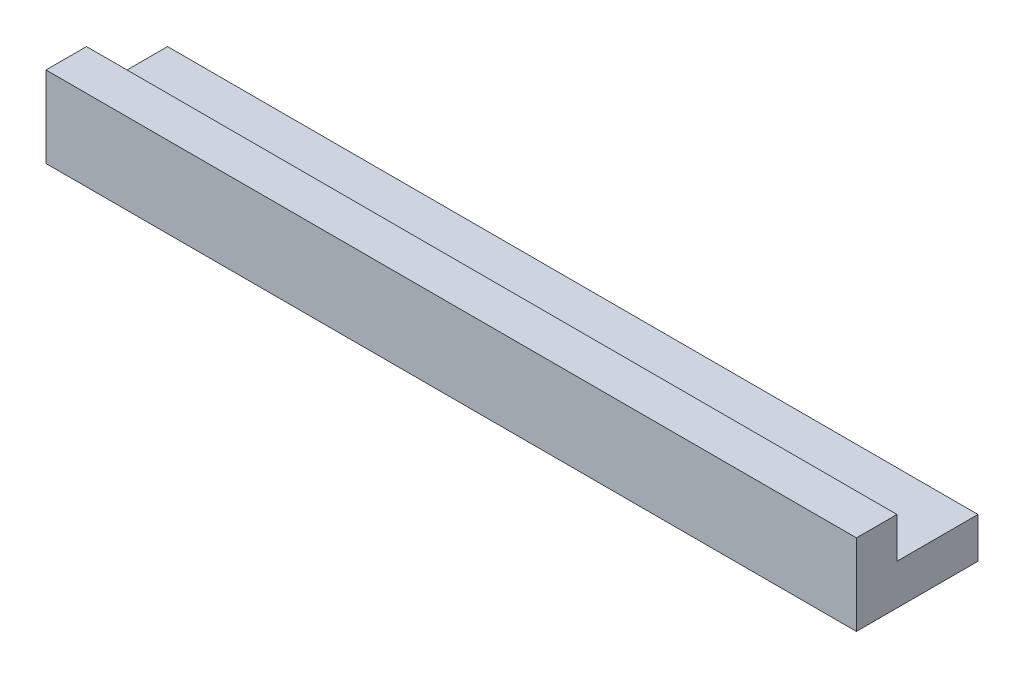
ISO-10303-21;
HEADER;
FILE_DESCRIPTION(('STEP AP214'),'2;1');
FILE_NAME('part.step','',(''),(''),'','','');
FILE_SCHEMA(('AUTOMOTIVE_DESIGN { 1 0 10303 214 1 1 1 1 }'));
ENDSEC;
DATA;
#1=APPLICATION_CONTEXT('core data for automotive mechanical design processes');
#2=APPLICATION_PROTOCOL_DEFINITION('international standard','automotive_design',2000,#1);
#3=PRODUCT_CONTEXT('',#1,'mechanical');
#4=PRODUCT('Part','Part','',(#3));
#5=PRODUCT_RELATED_PRODUCT_CATEGORY('part','',(#4));
#6=PRODUCT_DEFINITION_FORMATION('','',#4);
#7=PRODUCT_DEFINITION_CONTEXT('part definition',#1,'design');
#8=PRODUCT_DEFINITION('design','',#6,#7);
#9=PRODUCT_DEFINITION_SHAPE('','',#8);
#10=(LENGTH_UNIT() NAMED_UNIT(*) SI_UNIT(.MILLI.,.METRE.));
#11=(NAMED_UNIT(*) PLANE_ANGLE_UNIT() SI_UNIT($,.RADIAN.));
#12=(NAMED_UNIT(*) SI_UNIT($,.STERADIAN.) SOLID_ANGLE_UNIT());
#13=UNCERTAINTY_MEASURE_WITH_UNIT(LENGTH_MEASURE(1.E-05),#10,'distance_accuracy_value','');
#14=(GEOMETRIC_REPRESENTATION_CONTEXT(3) GLOBAL_UNCERTAINTY_ASSIGNED_CONTEXT((#13)) GLOBAL_UNIT_ASSIGNED_CONTEXT((#10,
#11,#12)) REPRESENTATION_CONTEXT('',''));
#15=CARTESIAN_POINT('',(0.,0.,0.));
#16=DIRECTION('',(0.,0.,1.));
#17=DIRECTION('',(1.,0.,0.));
#18=AXIS2_PLACEMENT_3D('',#15,#16,#17);
#19=CARTESIAN_POINT('',(40.,0.,0.));
#20=DIRECTION('',(0.,-1.,0.));
#21=DIRECTION('',(0.,0.,-1.));
#22=AXIS2_PLACEMENT_3D('',#19,#20,#21);
#23=PLANE('',#22);
#24=DIRECTION('',(0.,0.,1.));
#25=VECTOR('',#24,1.);
#26=CARTESIAN_POINT('',(0.,0.,0.));
#27=LINE('',#26,#25);
#28=CARTESIAN_POINT('',(0.,0.,0.));
#29=VERTEX_POINT('',#28);
#30=CARTESIAN_POINT('',(0.,0.,2.));
#31=VERTEX_POINT('',#30);
#32=EDGE_CURVE('E128',#29,#31,#27,.T.);
#33=ORIENTED_EDGE('',*,*,#32,.T.);
#34=DIRECTION('',(-1.,0.,0.));
#35=VECTOR('',#34,1.);
#36=CARTESIAN_POINT('',(40.,0.,2.));
#37=LINE('',#36,#35);
#38=CARTESIAN_POINT('',(40.,0.,2.));
#39=VERTEX_POINT('',#38);
#40=EDGE_CURVE('E11',#39,#31,#37,.T.);
#41=ORIENTED_EDGE('',*,*,#40,.F.);
#42=DIRECTION('',(0.,0.,1.));
#43=VECTOR('',#42,1.);
#44=CARTESIAN_POINT('',(40.,0.,0.));
#45=LINE('',#44,#43);
#46=CARTESIAN_POINT('',(40.,0.,0.));
#47=VERTEX_POINT('',#46);
#48=EDGE_CURVE('E144',#47,#39,#45,.T.);
#49=ORIENTED_EDGE('',*,*,#48,.F.);
#50=DIRECTION('',(-1.,0.,0.));
#51=VECTOR('',#50,1.);
#52=CARTESIAN_POINT('',(40.,0.,0.));
#53=LINE('',#52,#51);
#54=EDGE_CURVE('E124',#47,#29,#53,.T.);
#55=ORIENTED_EDGE('',*,*,#54,.T.);
#56=EDGE_LOOP('',(#33,#41,#49,#55));
#57=FACE_BOUND('',#56,.T.);
#58=ADVANCED_FACE('F39',(#57),#23,.F.);
#59=CARTESIAN_POINT('',(40.,0.,2.));
#60=DIRECTION('',(0.,0.,-1.));
#61=DIRECTION('',(-1.,0.,0.));
#62=AXIS2_PLACEMENT_3D('',#59,#60,#61);
#63=PLANE('',#62);
#64=DIRECTION('',(0.,-1.,0.));
#65=VECTOR('',#64,1.);
#66=CARTESIAN_POINT('',(0.,0.,2.));
#67=LINE('',#66,#65);
#68=CARTESIAN_POINT('',(0.,-4.,2.));
#69=VERTEX_POINT('',#68);
#70=EDGE_CURVE('E132',#31,#69,#67,.T.);
#71=ORIENTED_EDGE('',*,*,#70,.T.);
#72=DIRECTION('',(-1.,0.,0.));
#73=VECTOR('',#72,1.);
#74=CARTESIAN_POINT('',(40.,-4.,2.));
#75=LINE('',#74,#73);
#76=CARTESIAN_POINT('',(40.,-4.,2.));
#77=VERTEX_POINT('',#76);
#78=EDGE_CURVE('E48',#77,#69,#75,.T.);
#79=ORIENTED_EDGE('',*,*,#78,.F.);
#80=DIRECTION('',(0.,-1.,0.));
#81=VECTOR('',#80,1.);
#82=CARTESIAN_POINT('',(40.,0.,2.));
#83=LINE('',#82,#81);
#84=EDGE_CURVE('E93',#39,#77,#83,.T.);
#85=ORIENTED_EDGE('',*,*,#84,.F.);
#86=ORIENTED_EDGE('',*,*,#40,.T.);
#87=EDGE_LOOP('',(#71,#79,#85,#86));
#88=FACE_BOUND('',#87,.T.);
#89=ADVANCED_FACE('F172',(#88),#63,.F.);
#90=CARTESIAN_POINT('',(40.,-4.,2.));
#91=DIRECTION('',(0.,1.,0.));
#92=DIRECTION('',(0.,0.,1.));
#93=AXIS2_PLACEMENT_3D('',#90,#91,#92);
#94=PLANE('',#93);
#95=DIRECTION('',(0.,0.,-1.));
#96=VECTOR('',#95,1.);
#97=CARTESIAN_POINT('',(0.,-4.,2.));
#98=LINE('',#97,#96);
#99=CARTESIAN_POINT('',(0.,-4.,-4.));
#100=VERTEX_POINT('',#99);
#101=EDGE_CURVE('E135',#69,#100,#98,.T.);
#102=ORIENTED_EDGE('',*,*,#101,.T.);
#103=DIRECTION('',(-1.,0.,0.));
#104=VECTOR('',#103,1.);
#105=CARTESIAN_POINT('',(40.,-4.,-4.));
#106=LINE('',#105,#104);
#107=CARTESIAN_POINT('',(40.,-4.,-4.));
#108=VERTEX_POINT('',#107);
#109=EDGE_CURVE('E117',#108,#100,#106,.T.);
#110=ORIENTED_EDGE('',*,*,#109,.F.);
#111=DIRECTION('',(0.,0.,-1.));
#112=VECTOR('',#111,1.);
#113=CARTESIAN_POINT('',(40.,-4.,2.));
#114=LINE('',#113,#112);
#115=EDGE_CURVE('E106',#77,#108,#114,.T.);
#116=ORIENTED_EDGE('',*,*,#115,.F.);
#117=ORIENTED_EDGE('',*,*,#78,.T.);
#118=EDGE_LOOP('',(#102,#110,#116,#117));
#119=FACE_BOUND('',#118,.T.);
#120=ADVANCED_FACE('F154',(#119),#94,.F.);
#121=CARTESIAN_POINT('',(40.,-2.,-4.));
#122=DIRECTION('',(0.,0.,1.));
#123=DIRECTION('',(1.,0.,0.));
#124=AXIS2_PLACEMENT_3D('',#121,#122,#123);
#125=PLANE('',#124);
#126=DIRECTION('',(0.,1.,0.));
#127=VECTOR('',#126,1.);
#128=CARTESIAN_POINT('',(0.,-2.,-4.));
#129=LINE('',#128,#127);
#130=CARTESIAN_POINT('',(0.,-2.,-4.));
#131=VERTEX_POINT('',#130);
#132=EDGE_CURVE('E115',#100,#131,#129,.T.);
#133=ORIENTED_EDGE('',*,*,#132,.T.);
#134=DIRECTION('',(-1.,0.,0.));
#135=VECTOR('',#134,1.);
#136=CARTESIAN_POINT('',(40.,-2.,-4.));
#137=LINE('',#136,#135);
#138=CARTESIAN_POINT('',(40.,-2.,-4.));
#139=VERTEX_POINT('',#138);
#140=EDGE_CURVE('E112',#139,#131,#137,.T.);
#141=ORIENTED_EDGE('',*,*,#140,.F.);
#142=DIRECTION('',(0.,1.,0.));
#143=VECTOR('',#142,1.);
#144=CARTESIAN_POINT('',(40.,-2.,-4.));
#145=LINE('',#144,#143);
#146=EDGE_CURVE('E100',#108,#139,#145,.T.);
#147=ORIENTED_EDGE('',*,*,#146,.F.);
#148=ORIENTED_EDGE('',*,*,#109,.T.);
#149=EDGE_LOOP('',(#133,#141,#147,#148));
#150=FACE_BOUND('',#149,.T.);
#151=ADVANCED_FACE('F113',(#150),#125,.F.);
#152=CARTESIAN_POINT('',(40.,-2.,0.));
#153=DIRECTION('',(0.,-1.,0.));
#154=DIRECTION('',(0.,0.,-1.));
#155=AXIS2_PLACEMENT_3D('',#152,#153,#154);
#156=PLANE('',#155);
#157=DIRECTION('',(0.,0.,1.));
#158=VECTOR('',#157,1.);
#159=CARTESIAN_POINT('',(0.,-2.,0.));
#160=LINE('',#159,#158);
#161=CARTESIAN_POINT('',(0.,-2.,0.));
#162=VERTEX_POINT('',#161);
#163=EDGE_CURVE('E79',#131,#162,#160,.T.);
#164=ORIENTED_EDGE('',*,*,#163,.T.);
#165=DIRECTION('',(-1.,0.,0.));
#166=VECTOR('',#165,1.);
#167=CARTESIAN_POINT('',(40.,-2.,0.));
#168=LINE('',#167,#166);
#169=CARTESIAN_POINT('',(40.,-2.,0.));
#170=VERTEX_POINT('',#169);
#171=EDGE_CURVE('E118',#170,#162,#168,.T.);
#172=ORIENTED_EDGE('',*,*,#171,.F.);
#173=DIRECTION('',(0.,0.,1.));
#174=VECTOR('',#173,1.);
#175=CARTESIAN_POINT('',(40.,-2.,0.));
#176=LINE('',#175,#174);
#177=EDGE_CURVE('E104',#139,#170,#176,.T.);
#178=ORIENTED_EDGE('',*,*,#177,.F.);
#179=ORIENTED_EDGE('',*,*,#140,.T.);
#180=EDGE_LOOP('',(#164,#172,#178,#179));
#181=FACE_BOUND('',#180,.T.);
#182=ADVANCED_FACE('F120',(#181),#156,.F.);
#183=CARTESIAN_POINT('',(40.,0.,0.));
#184=DIRECTION('',(0.,0.,1.));
#185=DIRECTION('',(0.,-1.,0.));
#186=AXIS2_PLACEMENT_3D('',#183,#184,#185);
#187=PLANE('',#186);
#188=DIRECTION('',(0.,1.,0.));
#189=VECTOR('',#188,1.);
#190=CARTESIAN_POINT('',(0.,0.,0.));
#191=LINE('',#190,#189);
#192=EDGE_CURVE('E85',#162,#29,#191,.T.);
#193=ORIENTED_EDGE('',*,*,#192,.T.);
#194=ORIENTED_EDGE('',*,*,#54,.F.);
#195=DIRECTION('',(0.,1.,0.));
#196=VECTOR('',#195,1.);
#197=CARTESIAN_POINT('',(40.,0.,0.));
#198=LINE('',#197,#196);
#199=EDGE_CURVE('E56',#170,#47,#198,.T.);
#200=ORIENTED_EDGE('',*,*,#199,.F.);
#201=ORIENTED_EDGE('',*,*,#171,.T.);
#202=EDGE_LOOP('',(#193,#194,#200,#201));
#203=FACE_BOUND('',#202,.T.);
#204=ADVANCED_FACE('F161',(#203),#187,.F.);
#205=CARTESIAN_POINT('',(40.,0.,0.));
#206=DIRECTION('',(1.,0.,0.));
#207=DIRECTION('',(0.,0.,-1.));
#208=AXIS2_PLACEMENT_3D('',#205,#206,#207);
#209=PLANE('',#208);
#210=ORIENTED_EDGE('',*,*,#48,.T.);
#211=ORIENTED_EDGE('',*,*,#84,.T.);
#212=ORIENTED_EDGE('',*,*,#115,.T.);
#213=ORIENTED_EDGE('',*,*,#146,.T.);
#214=ORIENTED_EDGE('',*,*,#177,.T.);
#215=ORIENTED_EDGE('',*,*,#199,.T.);
#216=EDGE_LOOP('',(#210,#211,#212,#213,#214,#215));
#217=FACE_BOUND('',#216,.T.);
#218=ADVANCED_FACE('F102',(#217),#209,.T.);
#219=CARTESIAN_POINT('',(0.,0.,0.));
#220=DIRECTION('',(1.,0.,0.));
#221=DIRECTION('',(0.,0.,-1.));
#222=AXIS2_PLACEMENT_3D('',#219,#220,#221);
#223=PLANE('',#222);
#224=ORIENTED_EDGE('',*,*,#32,.F.);
#225=ORIENTED_EDGE('',*,*,#192,.F.);
#226=ORIENTED_EDGE('',*,*,#163,.F.);
#227=ORIENTED_EDGE('',*,*,#132,.F.);
#228=ORIENTED_EDGE('',*,*,#101,.F.);
#229=ORIENTED_EDGE('',*,*,#70,.F.);
#230=EDGE_LOOP('',(#224,#225,#226,#227,#228,#229));
#231=FACE_BOUND('',#230,.T.);
#232=ADVANCED_FACE('F157',(#231),#223,.F.);
#233=CLOSED_SHELL('',(#58,#89,#120,#151,#182,#204,#218,#232));
#234=MANIFOLD_SOLID_BREP('B2',#233);
#235=ADVANCED_BREP_SHAPE_REPRESENTATION('',(#18,#234),#14);
#236=SHAPE_DEFINITION_REPRESENTATION(#9,#235);
ENDSEC;
END-ISO-10303-21;
